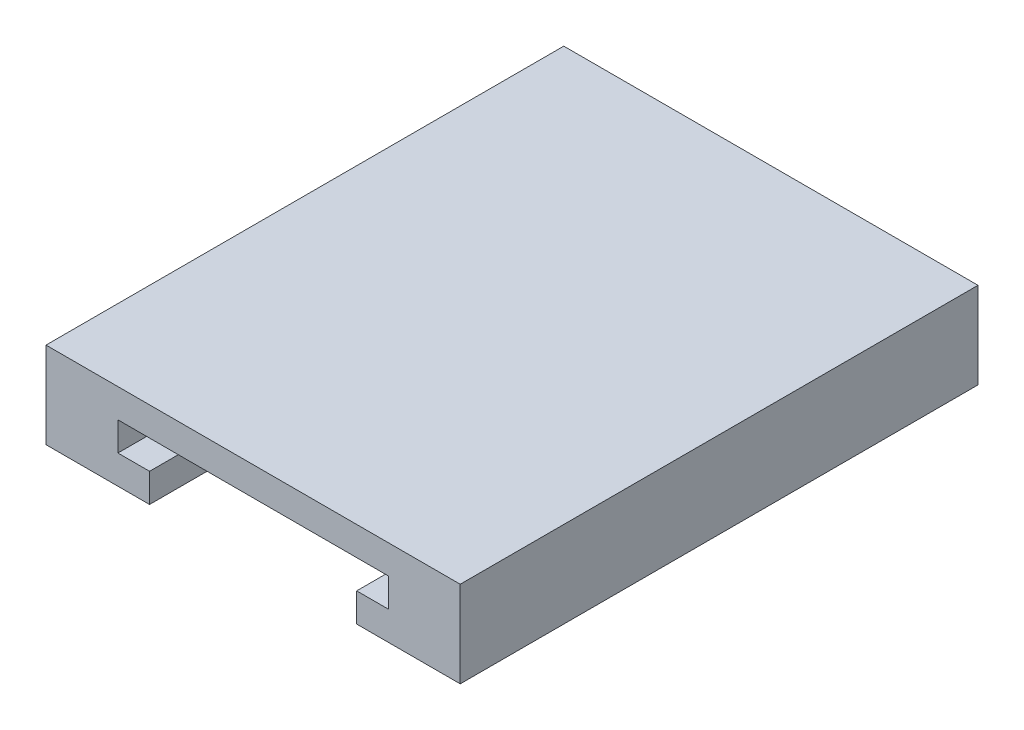
ISO-10303-21;
HEADER;
FILE_DESCRIPTION(('STEP AP214'),'2;1');
FILE_NAME('part.step','',(''),(''),'','','');
FILE_SCHEMA(('AUTOMOTIVE_DESIGN { 1 0 10303 214 1 1 1 1 }'));
ENDSEC;
DATA;
#1=APPLICATION_CONTEXT('core data for automotive mechanical design processes');
#2=APPLICATION_PROTOCOL_DEFINITION('international standard','automotive_design',2000,#1);
#3=PRODUCT_CONTEXT('',#1,'mechanical');
#4=PRODUCT('Part','Part','',(#3));
#5=PRODUCT_RELATED_PRODUCT_CATEGORY('part','',(#4));
#6=PRODUCT_DEFINITION_FORMATION('','',#4);
#7=PRODUCT_DEFINITION_CONTEXT('part definition',#1,'design');
#8=PRODUCT_DEFINITION('design','',#6,#7);
#9=PRODUCT_DEFINITION_SHAPE('','',#8);
#10=(LENGTH_UNIT() NAMED_UNIT(*) SI_UNIT(.MILLI.,.METRE.));
#11=(NAMED_UNIT(*) PLANE_ANGLE_UNIT() SI_UNIT($,.RADIAN.));
#12=(NAMED_UNIT(*) SI_UNIT($,.STERADIAN.) SOLID_ANGLE_UNIT());
#13=UNCERTAINTY_MEASURE_WITH_UNIT(LENGTH_MEASURE(1.E-05),#10,'distance_accuracy_value','');
#14=(GEOMETRIC_REPRESENTATION_CONTEXT(3) GLOBAL_UNCERTAINTY_ASSIGNED_CONTEXT((#13)) GLOBAL_UNIT_ASSIGNED_CONTEXT((#10,
#11,#12)) REPRESENTATION_CONTEXT('',''));
#15=CARTESIAN_POINT('',(0.,0.,0.));
#16=DIRECTION('',(0.,0.,1.));
#17=DIRECTION('',(1.,0.,0.));
#18=AXIS2_PLACEMENT_3D('',#15,#16,#17);
#19=CARTESIAN_POINT('',(0.,0.289855072463774,45.));
#20=DIRECTION('',(0.,1.,0.));
#21=DIRECTION('',(-1.,0.,0.));
#22=AXIS2_PLACEMENT_3D('',#19,#20,#21);
#23=PLANE('',#22);
#24=CARTESIAN_POINT('',(14.7971014492753,0.289855072463775,32.5));
#25=DIRECTION('',(0.,-1.,0.));
#26=DIRECTION('',(1.,0.,0.));
#27=AXIS2_PLACEMENT_3D('',#24,#25,#26);
#28=CIRCLE('',#27,1.25);
#29=CARTESIAN_POINT('',(16.0471014492753,0.289855072463775,32.5));
#30=VERTEX_POINT('',#29);
#31=EDGE_CURVE('E256',#30,#30,#28,.T.);
#32=ORIENTED_EDGE('',*,*,#31,.F.);
#33=EDGE_LOOP('',(#32));
#34=FACE_BOUND('',#33,.T.);
#35=CARTESIAN_POINT('',(14.7971014492753,0.289855072463775,12.5));
#36=DIRECTION('',(0.,-1.,0.));
#37=DIRECTION('',(-1.,0.,0.));
#38=AXIS2_PLACEMENT_3D('',#35,#36,#37);
#39=CIRCLE('',#38,1.25);
#40=CARTESIAN_POINT('',(13.5471014492753,0.289855072463775,12.5));
#41=VERTEX_POINT('',#40);
#42=EDGE_CURVE('E302',#41,#41,#39,.T.);
#43=ORIENTED_EDGE('',*,*,#42,.F.);
#44=EDGE_LOOP('',(#43));
#45=FACE_BOUND('',#44,.T.);
#46=DIRECTION('',(1.,0.,0.));
#47=VECTOR('',#46,1.);
#48=CARTESIAN_POINT('',(0.,0.289855072463774,0.));
#49=LINE('',#48,#47);
#50=CARTESIAN_POINT('',(3.04710144927535,0.289855072463774,0.));
#51=VERTEX_POINT('',#50);
#52=CARTESIAN_POINT('',(26.5471014492753,0.289855072463774,0.));
#53=VERTEX_POINT('',#52);
#54=EDGE_CURVE('E133',#51,#53,#49,.T.);
#55=ORIENTED_EDGE('',*,*,#54,.T.);
#56=DIRECTION('',(0.,0.,-1.));
#57=VECTOR('',#56,1.);
#58=CARTESIAN_POINT('',(26.5471014492753,0.289855072463774,45.));
#59=LINE('',#58,#57);
#60=CARTESIAN_POINT('',(26.5471014492753,0.289855072463774,45.));
#61=VERTEX_POINT('',#60);
#62=EDGE_CURVE('E137',#61,#53,#59,.T.);
#63=ORIENTED_EDGE('',*,*,#62,.F.);
#64=DIRECTION('',(1.,0.,0.));
#65=VECTOR('',#64,1.);
#66=CARTESIAN_POINT('',(0.,0.289855072463774,45.));
#67=LINE('',#66,#65);
#68=CARTESIAN_POINT('',(3.04710144927535,0.289855072463774,45.));
#69=VERTEX_POINT('',#68);
#70=EDGE_CURVE('E158',#69,#61,#67,.T.);
#71=ORIENTED_EDGE('',*,*,#70,.F.);
#72=DIRECTION('',(0.,0.,-1.));
#73=VECTOR('',#72,1.);
#74=CARTESIAN_POINT('',(3.04710144927535,0.289855072463774,45.));
#75=LINE('',#74,#73);
#76=EDGE_CURVE('E56',#69,#51,#75,.T.);
#77=ORIENTED_EDGE('',*,*,#76,.T.);
#78=EDGE_LOOP('',(#55,#63,#71,#77));
#79=FACE_BOUND('',#78,.T.);
#80=ADVANCED_FACE('F39',(#34,#45,#79),#23,.F.);
#81=CARTESIAN_POINT('',(0.,2.78985507246377,45.));
#82=DIRECTION('',(0.,1.,0.));
#83=DIRECTION('',(-1.,0.,0.));
#84=AXIS2_PLACEMENT_3D('',#81,#82,#83);
#85=PLANE('',#84);
#86=DIRECTION('',(1.,0.,0.));
#87=VECTOR('',#86,1.);
#88=CARTESIAN_POINT('',(0.,2.78985507246377,0.));
#89=LINE('',#88,#87);
#90=CARTESIAN_POINT('',(-3.20289855072465,2.78985507246377,0.));
#91=VERTEX_POINT('',#90);
#92=CARTESIAN_POINT('',(32.7971014492753,2.78985507246377,0.));
#93=VERTEX_POINT('',#92);
#94=EDGE_CURVE('E136',#91,#93,#89,.T.);
#95=ORIENTED_EDGE('',*,*,#94,.F.);
#96=DIRECTION('',(0.,0.,-1.));
#97=VECTOR('',#96,1.);
#98=CARTESIAN_POINT('',(-3.20289855072465,2.78985507246377,45.));
#99=LINE('',#98,#97);
#100=CARTESIAN_POINT('',(-3.20289855072465,2.78985507246377,45.));
#101=VERTEX_POINT('',#100);
#102=EDGE_CURVE('E11',#101,#91,#99,.T.);
#103=ORIENTED_EDGE('',*,*,#102,.F.);
#104=DIRECTION('',(1.,0.,0.));
#105=VECTOR('',#104,1.);
#106=CARTESIAN_POINT('',(0.,2.78985507246377,45.));
#107=LINE('',#106,#105);
#108=CARTESIAN_POINT('',(32.7971014492753,2.78985507246377,45.));
#109=VERTEX_POINT('',#108);
#110=EDGE_CURVE('E227',#101,#109,#107,.T.);
#111=ORIENTED_EDGE('',*,*,#110,.T.);
#112=DIRECTION('',(0.,0.,-1.));
#113=VECTOR('',#112,1.);
#114=CARTESIAN_POINT('',(32.7971014492753,2.78985507246377,45.));
#115=LINE('',#114,#113);
#116=EDGE_CURVE('E178',#109,#93,#115,.T.);
#117=ORIENTED_EDGE('',*,*,#116,.T.);
#118=EDGE_LOOP('',(#95,#103,#111,#117));
#119=FACE_BOUND('',#118,.T.);
#120=ADVANCED_FACE('F176',(#119),#85,.T.);
#121=CARTESIAN_POINT('',(-3.20289855072465,0.,45.));
#122=DIRECTION('',(-1.,0.,0.));
#123=DIRECTION('',(0.,0.,1.));
#124=AXIS2_PLACEMENT_3D('',#121,#122,#123);
#125=PLANE('',#124);
#126=DIRECTION('',(0.,1.,0.));
#127=VECTOR('',#126,1.);
#128=CARTESIAN_POINT('',(-3.20289855072465,0.,0.));
#129=LINE('',#128,#127);
#130=CARTESIAN_POINT('',(-3.20289855072465,-4.71014492753623,0.));
#131=VERTEX_POINT('',#130);
#132=EDGE_CURVE('E141',#131,#91,#129,.T.);
#133=ORIENTED_EDGE('',*,*,#132,.F.);
#134=DIRECTION('',(0.,0.,-1.));
#135=VECTOR('',#134,1.);
#136=CARTESIAN_POINT('',(-3.20289855072465,-4.71014492753623,45.));
#137=LINE('',#136,#135);
#138=CARTESIAN_POINT('',(-3.20289855072465,-4.71014492753623,45.));
#139=VERTEX_POINT('',#138);
#140=EDGE_CURVE('E48',#139,#131,#137,.T.);
#141=ORIENTED_EDGE('',*,*,#140,.F.);
#142=DIRECTION('',(0.,1.,0.));
#143=VECTOR('',#142,1.);
#144=CARTESIAN_POINT('',(-3.20289855072465,0.,45.));
#145=LINE('',#144,#143);
#146=EDGE_CURVE('E174',#139,#101,#145,.T.);
#147=ORIENTED_EDGE('',*,*,#146,.T.);
#148=ORIENTED_EDGE('',*,*,#102,.T.);
#149=EDGE_LOOP('',(#133,#141,#147,#148));
#150=FACE_BOUND('',#149,.T.);
#151=ADVANCED_FACE('F173',(#150),#125,.T.);
#152=CARTESIAN_POINT('',(0.,-4.71014492753623,45.));
#153=DIRECTION('',(0.,1.,0.));
#154=DIRECTION('',(0.,0.,1.));
#155=AXIS2_PLACEMENT_3D('',#152,#153,#154);
#156=PLANE('',#155);
#157=DIRECTION('',(1.,0.,0.));
#158=VECTOR('',#157,1.);
#159=CARTESIAN_POINT('',(0.,-4.71014492753623,0.));
#160=LINE('',#159,#158);
#161=CARTESIAN_POINT('',(5.79710144927535,-4.71014492753623,0.));
#162=VERTEX_POINT('',#161);
#163=EDGE_CURVE('E145',#131,#162,#160,.T.);
#164=ORIENTED_EDGE('',*,*,#163,.T.);
#165=DIRECTION('',(0.,0.,-1.));
#166=VECTOR('',#165,1.);
#167=CARTESIAN_POINT('',(5.79710144927535,-4.71014492753623,45.));
#168=LINE('',#167,#166);
#169=CARTESIAN_POINT('',(5.79710144927535,-4.71014492753623,45.));
#170=VERTEX_POINT('',#169);
#171=EDGE_CURVE('E111',#170,#162,#168,.T.);
#172=ORIENTED_EDGE('',*,*,#171,.F.);
#173=DIRECTION('',(1.,0.,0.));
#174=VECTOR('',#173,1.);
#175=CARTESIAN_POINT('',(0.,-4.71014492753623,45.));
#176=LINE('',#175,#174);
#177=EDGE_CURVE('E121',#139,#170,#176,.T.);
#178=ORIENTED_EDGE('',*,*,#177,.F.);
#179=ORIENTED_EDGE('',*,*,#140,.T.);
#180=EDGE_LOOP('',(#164,#172,#178,#179));
#181=FACE_BOUND('',#180,.T.);
#182=ADVANCED_FACE('F167',(#181),#156,.F.);
#183=CARTESIAN_POINT('',(5.79710144927535,0.,45.));
#184=DIRECTION('',(1.,0.,0.));
#185=DIRECTION('',(0.,0.,-1.));
#186=AXIS2_PLACEMENT_3D('',#183,#184,#185);
#187=PLANE('',#186);
#188=DIRECTION('',(0.,-1.,0.));
#189=VECTOR('',#188,1.);
#190=CARTESIAN_POINT('',(5.79710144927535,0.,0.));
#191=LINE('',#190,#189);
#192=CARTESIAN_POINT('',(5.79710144927535,-2.21014492753623,0.));
#193=VERTEX_POINT('',#192);
#194=EDGE_CURVE('E106',#193,#162,#191,.T.);
#195=ORIENTED_EDGE('',*,*,#194,.F.);
#196=DIRECTION('',(0.,0.,-1.));
#197=VECTOR('',#196,1.);
#198=CARTESIAN_POINT('',(5.79710144927535,-2.21014492753623,45.));
#199=LINE('',#198,#197);
#200=CARTESIAN_POINT('',(5.79710144927535,-2.21014492753623,45.));
#201=VERTEX_POINT('',#200);
#202=EDGE_CURVE('E101',#201,#193,#199,.T.);
#203=ORIENTED_EDGE('',*,*,#202,.F.);
#204=DIRECTION('',(0.,-1.,0.));
#205=VECTOR('',#204,1.);
#206=CARTESIAN_POINT('',(5.79710144927535,0.,45.));
#207=LINE('',#206,#205);
#208=EDGE_CURVE('E104',#201,#170,#207,.T.);
#209=ORIENTED_EDGE('',*,*,#208,.T.);
#210=ORIENTED_EDGE('',*,*,#171,.T.);
#211=EDGE_LOOP('',(#195,#203,#209,#210));
#212=FACE_BOUND('',#211,.T.);
#213=ADVANCED_FACE('F103',(#212),#187,.T.);
#214=CARTESIAN_POINT('',(0.,-2.21014492753623,45.));
#215=DIRECTION('',(0.,1.,0.));
#216=DIRECTION('',(-1.,0.,0.));
#217=AXIS2_PLACEMENT_3D('',#214,#215,#216);
#218=PLANE('',#217);
#219=DIRECTION('',(1.,0.,0.));
#220=VECTOR('',#219,1.);
#221=CARTESIAN_POINT('',(0.,-2.21014492753623,0.));
#222=LINE('',#221,#220);
#223=CARTESIAN_POINT('',(3.04710144927535,-2.21014492753623,0.));
#224=VERTEX_POINT('',#223);
#225=EDGE_CURVE('E151',#224,#193,#222,.T.);
#226=ORIENTED_EDGE('',*,*,#225,.F.);
#227=DIRECTION('',(0.,0.,-1.));
#228=VECTOR('',#227,1.);
#229=CARTESIAN_POINT('',(3.04710144927535,-2.21014492753623,45.));
#230=LINE('',#229,#228);
#231=CARTESIAN_POINT('',(3.04710144927535,-2.21014492753623,45.));
#232=VERTEX_POINT('',#231);
#233=EDGE_CURVE('E76',#232,#224,#230,.T.);
#234=ORIENTED_EDGE('',*,*,#233,.F.);
#235=DIRECTION('',(1.,0.,0.));
#236=VECTOR('',#235,1.);
#237=CARTESIAN_POINT('',(0.,-2.21014492753623,45.));
#238=LINE('',#237,#236);
#239=EDGE_CURVE('E118',#232,#201,#238,.T.);
#240=ORIENTED_EDGE('',*,*,#239,.T.);
#241=ORIENTED_EDGE('',*,*,#202,.T.);
#242=EDGE_LOOP('',(#226,#234,#240,#241));
#243=FACE_BOUND('',#242,.T.);
#244=ADVANCED_FACE('F125',(#243),#218,.T.);
#245=CARTESIAN_POINT('',(3.04710144927535,0.,45.));
#246=DIRECTION('',(1.,0.,0.));
#247=DIRECTION('',(0.,0.,-1.));
#248=AXIS2_PLACEMENT_3D('',#245,#246,#247);
#249=PLANE('',#248);
#250=DIRECTION('',(0.,-1.,0.));
#251=VECTOR('',#250,1.);
#252=CARTESIAN_POINT('',(3.04710144927535,0.,0.));
#253=LINE('',#252,#251);
#254=EDGE_CURVE('E154',#51,#224,#253,.T.);
#255=ORIENTED_EDGE('',*,*,#254,.F.);
#256=ORIENTED_EDGE('',*,*,#76,.F.);
#257=DIRECTION('',(0.,-1.,0.));
#258=VECTOR('',#257,1.);
#259=CARTESIAN_POINT('',(3.04710144927535,0.,45.));
#260=LINE('',#259,#258);
#261=EDGE_CURVE('E127',#69,#232,#260,.T.);
#262=ORIENTED_EDGE('',*,*,#261,.T.);
#263=ORIENTED_EDGE('',*,*,#233,.T.);
#264=EDGE_LOOP('',(#255,#256,#262,#263));
#265=FACE_BOUND('',#264,.T.);
#266=ADVANCED_FACE('F331',(#265),#249,.T.);
#267=CARTESIAN_POINT('',(0.,0.,45.));
#268=DIRECTION('',(0.,0.,1.));
#269=DIRECTION('',(1.,0.,0.));
#270=AXIS2_PLACEMENT_3D('',#267,#268,#269);
#271=PLANE('',#270);
#272=ORIENTED_EDGE('',*,*,#70,.T.);
#273=DIRECTION('',(0.,-1.,0.));
#274=VECTOR('',#273,1.);
#275=CARTESIAN_POINT('',(26.5471014492753,0.,45.));
#276=LINE('',#275,#274);
#277=CARTESIAN_POINT('',(26.5471014492753,-2.21014492753623,45.));
#278=VERTEX_POINT('',#277);
#279=EDGE_CURVE('E193',#61,#278,#276,.T.);
#280=ORIENTED_EDGE('',*,*,#279,.T.);
#281=DIRECTION('',(-1.,0.,0.));
#282=VECTOR('',#281,1.);
#283=CARTESIAN_POINT('',(29.5942028985507,-2.21014492753623,45.));
#284=LINE('',#283,#282);
#285=CARTESIAN_POINT('',(23.7971014492753,-2.21014492753623,45.));
#286=VERTEX_POINT('',#285);
#287=EDGE_CURVE('E199',#278,#286,#284,.T.);
#288=ORIENTED_EDGE('',*,*,#287,.T.);
#289=DIRECTION('',(0.,-1.,0.));
#290=VECTOR('',#289,1.);
#291=CARTESIAN_POINT('',(23.7971014492753,0.,45.));
#292=LINE('',#291,#290);
#293=CARTESIAN_POINT('',(23.7971014492753,-4.71014492753623,45.));
#294=VERTEX_POINT('',#293);
#295=EDGE_CURVE('E239',#286,#294,#292,.T.);
#296=ORIENTED_EDGE('',*,*,#295,.T.);
#297=DIRECTION('',(-1.,0.,0.));
#298=VECTOR('',#297,1.);
#299=CARTESIAN_POINT('',(29.5942028985507,-4.71014492753623,45.));
#300=LINE('',#299,#298);
#301=CARTESIAN_POINT('',(32.7971014492753,-4.71014492753623,45.));
#302=VERTEX_POINT('',#301);
#303=EDGE_CURVE('E235',#302,#294,#300,.T.);
#304=ORIENTED_EDGE('',*,*,#303,.F.);
#305=DIRECTION('',(0.,1.,0.));
#306=VECTOR('',#305,1.);
#307=CARTESIAN_POINT('',(32.7971014492753,0.,45.));
#308=LINE('',#307,#306);
#309=EDGE_CURVE('E207',#302,#109,#308,.T.);
#310=ORIENTED_EDGE('',*,*,#309,.T.);
#311=ORIENTED_EDGE('',*,*,#110,.F.);
#312=ORIENTED_EDGE('',*,*,#146,.F.);
#313=ORIENTED_EDGE('',*,*,#177,.T.);
#314=ORIENTED_EDGE('',*,*,#208,.F.);
#315=ORIENTED_EDGE('',*,*,#239,.F.);
#316=ORIENTED_EDGE('',*,*,#261,.F.);
#317=EDGE_LOOP('',(#272,#280,#288,#296,#304,#310,#311,#312,#313,#314,#315,#316));
#318=FACE_BOUND('',#317,.T.);
#319=ADVANCED_FACE('F116',(#318),#271,.T.);
#320=CARTESIAN_POINT('',(0.,0.,0.));
#321=DIRECTION('',(0.,0.,1.));
#322=DIRECTION('',(1.,0.,0.));
#323=AXIS2_PLACEMENT_3D('',#320,#321,#322);
#324=PLANE('',#323);
#325=ORIENTED_EDGE('',*,*,#54,.F.);
#326=ORIENTED_EDGE('',*,*,#254,.T.);
#327=ORIENTED_EDGE('',*,*,#225,.T.);
#328=ORIENTED_EDGE('',*,*,#194,.T.);
#329=ORIENTED_EDGE('',*,*,#163,.F.);
#330=ORIENTED_EDGE('',*,*,#132,.T.);
#331=ORIENTED_EDGE('',*,*,#94,.T.);
#332=DIRECTION('',(0.,1.,0.));
#333=VECTOR('',#332,1.);
#334=CARTESIAN_POINT('',(32.7971014492753,0.,0.));
#335=LINE('',#334,#333);
#336=CARTESIAN_POINT('',(32.7971014492753,-4.71014492753623,0.));
#337=VERTEX_POINT('',#336);
#338=EDGE_CURVE('E183',#337,#93,#335,.T.);
#339=ORIENTED_EDGE('',*,*,#338,.F.);
#340=DIRECTION('',(-1.,0.,0.));
#341=VECTOR('',#340,1.);
#342=CARTESIAN_POINT('',(29.5942028985507,-4.71014492753623,0.));
#343=LINE('',#342,#341);
#344=CARTESIAN_POINT('',(23.7971014492753,-4.71014492753623,0.));
#345=VERTEX_POINT('',#344);
#346=EDGE_CURVE('E194',#337,#345,#343,.T.);
#347=ORIENTED_EDGE('',*,*,#346,.T.);
#348=DIRECTION('',(0.,-1.,0.));
#349=VECTOR('',#348,1.);
#350=CARTESIAN_POINT('',(23.7971014492753,0.,0.));
#351=LINE('',#350,#349);
#352=CARTESIAN_POINT('',(23.7971014492753,-2.21014492753623,0.));
#353=VERTEX_POINT('',#352);
#354=EDGE_CURVE('E201',#353,#345,#351,.T.);
#355=ORIENTED_EDGE('',*,*,#354,.F.);
#356=DIRECTION('',(-1.,0.,0.));
#357=VECTOR('',#356,1.);
#358=CARTESIAN_POINT('',(29.5942028985507,-2.21014492753623,0.));
#359=LINE('',#358,#357);
#360=CARTESIAN_POINT('',(26.5471014492753,-2.21014492753623,0.));
#361=VERTEX_POINT('',#360);
#362=EDGE_CURVE('E255',#361,#353,#359,.T.);
#363=ORIENTED_EDGE('',*,*,#362,.F.);
#364=DIRECTION('',(0.,-1.,0.));
#365=VECTOR('',#364,1.);
#366=CARTESIAN_POINT('',(26.5471014492753,0.,0.));
#367=LINE('',#366,#365);
#368=EDGE_CURVE('E251',#53,#361,#367,.T.);
#369=ORIENTED_EDGE('',*,*,#368,.F.);
#370=EDGE_LOOP('',(#325,#326,#327,#328,#329,#330,#331,#339,#347,#355,#363,#369));
#371=FACE_BOUND('',#370,.T.);
#372=ADVANCED_FACE('F172',(#371),#324,.F.);
#373=CARTESIAN_POINT('',(26.5471014492753,0.,45.));
#374=DIRECTION('',(1.,0.,0.));
#375=DIRECTION('',(0.,0.,-1.));
#376=AXIS2_PLACEMENT_3D('',#373,#374,#375);
#377=PLANE('',#376);
#378=ORIENTED_EDGE('',*,*,#368,.T.);
#379=DIRECTION('',(0.,0.,-1.));
#380=VECTOR('',#379,1.);
#381=CARTESIAN_POINT('',(26.5471014492753,-2.21014492753623,45.));
#382=LINE('',#381,#380);
#383=EDGE_CURVE('E218',#278,#361,#382,.T.);
#384=ORIENTED_EDGE('',*,*,#383,.F.);
#385=ORIENTED_EDGE('',*,*,#279,.F.);
#386=ORIENTED_EDGE('',*,*,#62,.T.);
#387=EDGE_LOOP('',(#378,#384,#385,#386));
#388=FACE_BOUND('',#387,.T.);
#389=ADVANCED_FACE('F314',(#388),#377,.F.);
#390=CARTESIAN_POINT('',(29.5942028985507,-2.21014492753623,45.));
#391=DIRECTION('',(0.,-1.,0.));
#392=DIRECTION('',(1.,0.,0.));
#393=AXIS2_PLACEMENT_3D('',#390,#391,#392);
#394=PLANE('',#393);
#395=ORIENTED_EDGE('',*,*,#362,.T.);
#396=DIRECTION('',(0.,0.,-1.));
#397=VECTOR('',#396,1.);
#398=CARTESIAN_POINT('',(23.7971014492753,-2.21014492753623,45.));
#399=LINE('',#398,#397);
#400=EDGE_CURVE('E214',#286,#353,#399,.T.);
#401=ORIENTED_EDGE('',*,*,#400,.F.);
#402=ORIENTED_EDGE('',*,*,#287,.F.);
#403=ORIENTED_EDGE('',*,*,#383,.T.);
#404=EDGE_LOOP('',(#395,#401,#402,#403));
#405=FACE_BOUND('',#404,.T.);
#406=ADVANCED_FACE('F317',(#405),#394,.F.);
#407=CARTESIAN_POINT('',(23.7971014492753,0.,45.));
#408=DIRECTION('',(1.,0.,0.));
#409=DIRECTION('',(0.,0.,-1.));
#410=AXIS2_PLACEMENT_3D('',#407,#408,#409);
#411=PLANE('',#410);
#412=ORIENTED_EDGE('',*,*,#354,.T.);
#413=DIRECTION('',(0.,0.,-1.));
#414=VECTOR('',#413,1.);
#415=CARTESIAN_POINT('',(23.7971014492753,-4.71014492753623,45.));
#416=LINE('',#415,#414);
#417=EDGE_CURVE('E210',#294,#345,#416,.T.);
#418=ORIENTED_EDGE('',*,*,#417,.F.);
#419=ORIENTED_EDGE('',*,*,#295,.F.);
#420=ORIENTED_EDGE('',*,*,#400,.T.);
#421=EDGE_LOOP('',(#412,#418,#419,#420));
#422=FACE_BOUND('',#421,.T.);
#423=ADVANCED_FACE('F265',(#422),#411,.F.);
#424=CARTESIAN_POINT('',(29.5942028985507,-4.71014492753623,45.));
#425=DIRECTION('',(0.,-1.,0.));
#426=DIRECTION('',(0.,0.,-1.));
#427=AXIS2_PLACEMENT_3D('',#424,#425,#426);
#428=PLANE('',#427);
#429=ORIENTED_EDGE('',*,*,#346,.F.);
#430=DIRECTION('',(0.,0.,-1.));
#431=VECTOR('',#430,1.);
#432=CARTESIAN_POINT('',(32.7971014492753,-4.71014492753623,45.));
#433=LINE('',#432,#431);
#434=EDGE_CURVE('E191',#302,#337,#433,.T.);
#435=ORIENTED_EDGE('',*,*,#434,.F.);
#436=ORIENTED_EDGE('',*,*,#303,.T.);
#437=ORIENTED_EDGE('',*,*,#417,.T.);
#438=EDGE_LOOP('',(#429,#435,#436,#437));
#439=FACE_BOUND('',#438,.T.);
#440=ADVANCED_FACE('F272',(#439),#428,.T.);
#441=CARTESIAN_POINT('',(32.7971014492753,0.,45.));
#442=DIRECTION('',(-1.,0.,0.));
#443=DIRECTION('',(0.,0.,1.));
#444=AXIS2_PLACEMENT_3D('',#441,#442,#443);
#445=PLANE('',#444);
#446=ORIENTED_EDGE('',*,*,#338,.T.);
#447=ORIENTED_EDGE('',*,*,#116,.F.);
#448=ORIENTED_EDGE('',*,*,#309,.F.);
#449=ORIENTED_EDGE('',*,*,#434,.T.);
#450=EDGE_LOOP('',(#446,#447,#448,#449));
#451=FACE_BOUND('',#450,.T.);
#452=ADVANCED_FACE('F188',(#451),#445,.F.);
#453=CARTESIAN_POINT('',(14.7971014492753,0.289855072463775,12.5));
#454=DIRECTION('',(0.,-1.,0.));
#455=DIRECTION('',(-1.,0.,0.));
#456=AXIS2_PLACEMENT_3D('',#453,#454,#455);
#457=CONICAL_SURFACE('',#456,1.25,0.78539816339745);
#458=CARTESIAN_POINT('',(14.7971014492753,1.53985507246377,12.5));
#459=VERTEX_POINT('',#458);
#460=VERTEX_LOOP('',#459);
#461=FACE_BOUND('',#460,.T.);
#462=ORIENTED_EDGE('',*,*,#42,.T.);
#463=EDGE_LOOP('',(#462));
#464=FACE_BOUND('',#463,.T.);
#465=ADVANCED_FACE('F296',(#461,#464),#457,.F.);
#466=CARTESIAN_POINT('',(14.7971014492753,0.289855072463775,32.5));
#467=DIRECTION('',(0.,-1.,0.));
#468=DIRECTION('',(1.,0.,0.));
#469=AXIS2_PLACEMENT_3D('',#466,#467,#468);
#470=CONICAL_SURFACE('',#469,1.25,0.78539816339745);
#471=CARTESIAN_POINT('',(14.7971014492753,1.53985507246377,32.5));
#472=VERTEX_POINT('',#471);
#473=VERTEX_LOOP('',#472);
#474=FACE_BOUND('',#473,.T.);
#475=ORIENTED_EDGE('',*,*,#31,.T.);
#476=EDGE_LOOP('',(#475));
#477=FACE_BOUND('',#476,.T.);
#478=ADVANCED_FACE('F293',(#474,#477),#470,.F.);
#479=CLOSED_SHELL('',(#80,#120,#151,#182,#213,#244,#266,#319,#372,#389,#406,#423,#440,#452,#465,#478));
#480=MANIFOLD_SOLID_BREP('B2',#479);
#481=ADVANCED_BREP_SHAPE_REPRESENTATION('',(#18,#480),#14);
#482=SHAPE_DEFINITION_REPRESENTATION(#9,#481);
ENDSEC;
END-ISO-10303-21;
